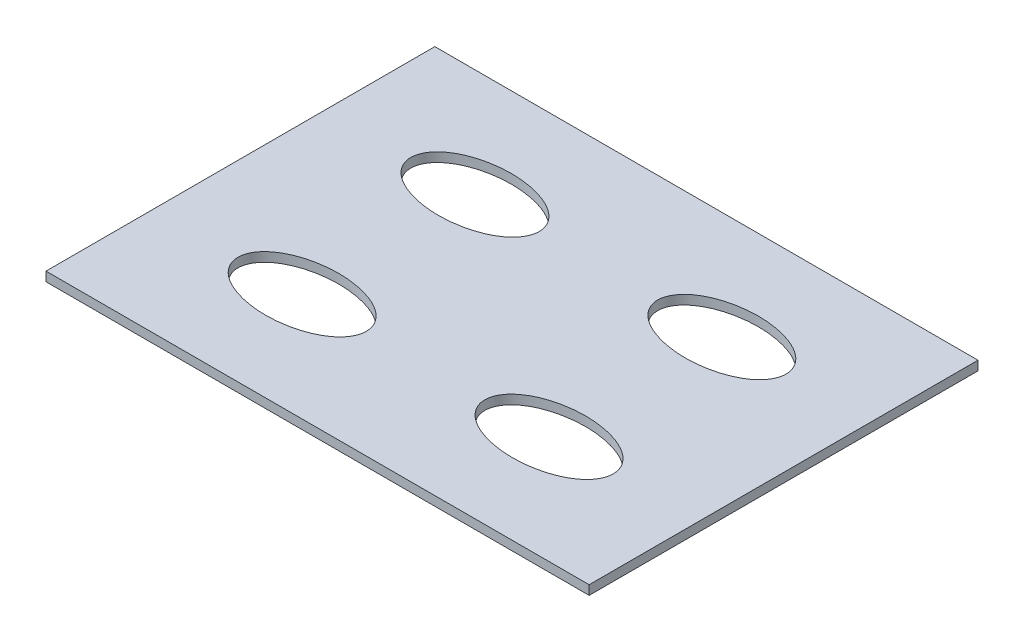
ISO-10303-21;
HEADER;
FILE_DESCRIPTION(('STEP AP214'),'2;1');
FILE_NAME('part.step','',(''),(''),'','','');
FILE_SCHEMA(('AUTOMOTIVE_DESIGN { 1 0 10303 214 1 1 1 1 }'));
ENDSEC;
DATA;
#1=APPLICATION_CONTEXT('core data for automotive mechanical design processes');
#2=APPLICATION_PROTOCOL_DEFINITION('international standard','automotive_design',2000,#1);
#3=PRODUCT_CONTEXT('',#1,'mechanical');
#4=PRODUCT('Part','Part','',(#3));
#5=PRODUCT_RELATED_PRODUCT_CATEGORY('part','',(#4));
#6=PRODUCT_DEFINITION_FORMATION('','',#4);
#7=PRODUCT_DEFINITION_CONTEXT('part definition',#1,'design');
#8=PRODUCT_DEFINITION('design','',#6,#7);
#9=PRODUCT_DEFINITION_SHAPE('','',#8);
#10=(LENGTH_UNIT() NAMED_UNIT(*) SI_UNIT(.MILLI.,.METRE.));
#11=(NAMED_UNIT(*) PLANE_ANGLE_UNIT() SI_UNIT($,.RADIAN.));
#12=(NAMED_UNIT(*) SI_UNIT($,.STERADIAN.) SOLID_ANGLE_UNIT());
#13=UNCERTAINTY_MEASURE_WITH_UNIT(LENGTH_MEASURE(1.E-05),#10,'distance_accuracy_value','');
#14=(GEOMETRIC_REPRESENTATION_CONTEXT(3) GLOBAL_UNCERTAINTY_ASSIGNED_CONTEXT((#13)) GLOBAL_UNIT_ASSIGNED_CONTEXT((#10,
#11,#12)) REPRESENTATION_CONTEXT('',''));
#15=CARTESIAN_POINT('',(0.,0.,0.));
#16=DIRECTION('',(0.,0.,1.));
#17=DIRECTION('',(1.,0.,0.));
#18=AXIS2_PLACEMENT_3D('',#15,#16,#17);
#19=CARTESIAN_POINT('',(0.,0.75,0.));
#20=DIRECTION('',(0.,1.,0.));
#21=DIRECTION('',(0.,0.,1.));
#22=AXIS2_PLACEMENT_3D('',#19,#20,#21);
#23=PLANE('',#22);
#24=CARTESIAN_POINT('',(4.8,0.75,-7.));
#25=CARTESIAN_POINT('',(4.8,0.75,-6.59500225181792));
#26=CARTESIAN_POINT('',(5.09948395130279,0.75,-5.78500675545376));
#27=CARTESIAN_POINT('',(6.66931282279761,0.75,-4.50337965273074));
#28=CARTESIAN_POINT('',(10.,0.75,-3.74774689817951));
#29=CARTESIAN_POINT('',(13.3306871772024,0.75,-4.50337965273074));
#30=CARTESIAN_POINT('',(14.9005160486972,0.75,-5.78500675545376));
#31=CARTESIAN_POINT('',(15.3497419756514,0.75,-7.));
#32=CARTESIAN_POINT('',(14.9005160486972,0.75,-8.21499324454625));
#33=CARTESIAN_POINT('',(13.3306871772024,0.75,-9.49662034726926));
#34=CARTESIAN_POINT('',(10.,0.75,-10.2522531018205));
#35=CARTESIAN_POINT('',(6.66931282279761,0.75,-9.49662034726926));
#36=CARTESIAN_POINT('',(5.09948395130279,0.75,-8.21499324454625));
#37=CARTESIAN_POINT('',(4.8,0.75,-7.40499774818209));
#38=CARTESIAN_POINT('',(4.8,0.75,-7.));
#39=B_SPLINE_CURVE_WITH_KNOTS('',3,(#24,#25,#26,#27,#28,#29,#30,#31,#32,#33,#34,#35,#36,#37,
#38),.UNSPECIFIED.,.T.,.F.,(4,1,1,1,1,1,1,1,1,1,1,1,4),(0.,0.392699081698724,0.785398163397448,
1.5707963267949,2.35619449019234,2.74889357189107,3.14159265358979,3.53429173528852,
3.92699081698724,4.71238898038469,5.49778714378214,5.89048622548086,6.28318530717959),.UNSPECIFIED.);
#40=CARTESIAN_POINT('',(4.8,0.75,-7.));
#41=VERTEX_POINT('',#40);
#42=EDGE_CURVE('E237',#41,#41,#39,.T.);
#43=ORIENTED_EDGE('',*,*,#42,.F.);
#44=EDGE_LOOP('',(#43));
#45=FACE_BOUND('',#44,.T.);
#46=CARTESIAN_POINT('',(-15.2,0.75,7.));
#47=CARTESIAN_POINT('',(-15.2,0.75,7.40499774818208));
#48=CARTESIAN_POINT('',(-14.9005160486972,0.75,8.21499324454624));
#49=CARTESIAN_POINT('',(-13.3306871772024,0.75,9.49662034726925));
#50=CARTESIAN_POINT('',(-10.,0.75,10.2522531018205));
#51=CARTESIAN_POINT('',(-6.66931282279761,0.75,9.49662034726926));
#52=CARTESIAN_POINT('',(-5.09948395130279,0.75,8.21499324454624));
#53=CARTESIAN_POINT('',(-4.6502580243486,0.75,7.));
#54=CARTESIAN_POINT('',(-5.09948395130279,0.75,5.78500675545376));
#55=CARTESIAN_POINT('',(-6.6693128227976,0.75,4.50337965273074));
#56=CARTESIAN_POINT('',(-10.,0.75,3.7477468981795));
#57=CARTESIAN_POINT('',(-13.3306871772024,0.75,4.50337965273073));
#58=CARTESIAN_POINT('',(-14.9005160486972,0.75,5.78500675545376));
#59=CARTESIAN_POINT('',(-15.2,0.75,6.59500225181792));
#60=CARTESIAN_POINT('',(-15.2,0.75,7.));
#61=B_SPLINE_CURVE_WITH_KNOTS('',3,(#46,#47,#48,#49,#50,#51,#52,#53,#54,#55,#56,#57,#58,#59,
#60),.UNSPECIFIED.,.T.,.F.,(4,1,1,1,1,1,1,1,1,1,1,1,4),(0.,0.392699081698724,0.785398163397448,
1.5707963267949,2.35619449019234,2.74889357189107,3.14159265358979,3.53429173528852,
3.92699081698724,4.71238898038469,5.49778714378214,5.89048622548086,6.28318530717959),.UNSPECIFIED.);
#62=CARTESIAN_POINT('',(-15.2,0.75,7.));
#63=VERTEX_POINT('',#62);
#64=EDGE_CURVE('E100',#63,#63,#61,.T.);
#65=ORIENTED_EDGE('',*,*,#64,.F.);
#66=EDGE_LOOP('',(#65));
#67=FACE_BOUND('',#66,.T.);
#68=DIRECTION('',(-1.,0.,0.));
#69=VECTOR('',#68,1.);
#70=CARTESIAN_POINT('',(22.,0.75,-15.75));
#71=LINE('',#70,#69);
#72=CARTESIAN_POINT('',(22.,0.75,-15.75));
#73=VERTEX_POINT('',#72);
#74=CARTESIAN_POINT('',(-22.,0.75,-15.75));
#75=VERTEX_POINT('',#74);
#76=EDGE_CURVE('E85',#73,#75,#71,.T.);
#77=ORIENTED_EDGE('',*,*,#76,.T.);
#78=DIRECTION('',(0.,0.,1.));
#79=VECTOR('',#78,1.);
#80=CARTESIAN_POINT('',(-22.,0.75,-15.75));
#81=LINE('',#80,#79);
#82=CARTESIAN_POINT('',(-22.,0.75,15.75));
#83=VERTEX_POINT('',#82);
#84=EDGE_CURVE('E80',#75,#83,#81,.T.);
#85=ORIENTED_EDGE('',*,*,#84,.T.);
#86=DIRECTION('',(1.,0.,0.));
#87=VECTOR('',#86,1.);
#88=CARTESIAN_POINT('',(-22.,0.75,15.75));
#89=LINE('',#88,#87);
#90=CARTESIAN_POINT('',(22.,0.75,15.75));
#91=VERTEX_POINT('',#90);
#92=EDGE_CURVE('E83',#83,#91,#89,.T.);
#93=ORIENTED_EDGE('',*,*,#92,.T.);
#94=DIRECTION('',(0.,0.,-1.));
#95=VECTOR('',#94,1.);
#96=CARTESIAN_POINT('',(22.,0.75,15.75));
#97=LINE('',#96,#95);
#98=EDGE_CURVE('E50',#91,#73,#97,.T.);
#99=ORIENTED_EDGE('',*,*,#98,.T.);
#100=EDGE_LOOP('',(#77,#85,#93,#99));
#101=FACE_BOUND('',#100,.T.);
#102=CARTESIAN_POINT('',(4.8,0.75,7.));
#103=CARTESIAN_POINT('',(4.8,0.75,7.40499774818208));
#104=CARTESIAN_POINT('',(5.09948395130279,0.75,8.21499324454624));
#105=CARTESIAN_POINT('',(6.66931282279761,0.75,9.49662034726925));
#106=CARTESIAN_POINT('',(10.,0.75,10.2522531018205));
#107=CARTESIAN_POINT('',(13.3306871772024,0.75,9.49662034726926));
#108=CARTESIAN_POINT('',(14.9005160486972,0.75,8.21499324454624));
#109=CARTESIAN_POINT('',(15.3497419756514,0.75,7.));
#110=CARTESIAN_POINT('',(14.9005160486972,0.75,5.78500675545376));
#111=CARTESIAN_POINT('',(13.3306871772024,0.75,4.50337965273074));
#112=CARTESIAN_POINT('',(10.,0.75,3.7477468981795));
#113=CARTESIAN_POINT('',(6.66931282279761,0.75,4.50337965273073));
#114=CARTESIAN_POINT('',(5.09948395130279,0.75,5.78500675545376));
#115=CARTESIAN_POINT('',(4.8,0.75,6.59500225181792));
#116=CARTESIAN_POINT('',(4.8,0.75,7.));
#117=B_SPLINE_CURVE_WITH_KNOTS('',3,(#102,#103,#104,#105,#106,#107,#108,#109,#110,#111,#112,
#113,#114,#115,#116),.UNSPECIFIED.,.T.,.F.,(4,1,1,1,1,1,1,1,1,1,1,1,4),(0.,0.392699081698724,
0.785398163397448,1.5707963267949,2.35619449019234,2.74889357189107,3.14159265358979,
3.53429173528852,3.92699081698724,4.71238898038469,5.49778714378214,5.89048622548086,
6.28318530717959),.UNSPECIFIED.);
#118=CARTESIAN_POINT('',(4.8,0.75,7.));
#119=VERTEX_POINT('',#118);
#120=EDGE_CURVE('E117',#119,#119,#117,.T.);
#121=ORIENTED_EDGE('',*,*,#120,.F.);
#122=EDGE_LOOP('',(#121));
#123=FACE_BOUND('',#122,.T.);
#124=CARTESIAN_POINT('',(-15.2,0.75,-7.));
#125=CARTESIAN_POINT('',(-15.2,0.75,-6.59500225181792));
#126=CARTESIAN_POINT('',(-14.9005160486972,0.75,-5.78500675545376));
#127=CARTESIAN_POINT('',(-13.3306871772024,0.75,-4.50337965273074));
#128=CARTESIAN_POINT('',(-10.,0.75,-3.74774689817951));
#129=CARTESIAN_POINT('',(-6.66931282279761,0.75,-4.50337965273074));
#130=CARTESIAN_POINT('',(-5.09948395130279,0.75,-5.78500675545376));
#131=CARTESIAN_POINT('',(-4.6502580243486,0.75,-7.));
#132=CARTESIAN_POINT('',(-5.09948395130279,0.75,-8.21499324454625));
#133=CARTESIAN_POINT('',(-6.6693128227976,0.75,-9.49662034726926));
#134=CARTESIAN_POINT('',(-10.,0.75,-10.2522531018205));
#135=CARTESIAN_POINT('',(-13.3306871772024,0.75,-9.49662034726926));
#136=CARTESIAN_POINT('',(-14.9005160486972,0.75,-8.21499324454625));
#137=CARTESIAN_POINT('',(-15.2,0.75,-7.40499774818209));
#138=CARTESIAN_POINT('',(-15.2,0.75,-7.));
#139=B_SPLINE_CURVE_WITH_KNOTS('',3,(#124,#125,#126,#127,#128,#129,#130,#131,#132,#133,#134,
#135,#136,#137,#138),.UNSPECIFIED.,.T.,.F.,(4,1,1,1,1,1,1,1,1,1,1,1,4),(0.,0.392699081698724,
0.785398163397448,1.5707963267949,2.35619449019234,2.74889357189107,3.14159265358979,
3.53429173528852,3.92699081698724,4.71238898038469,5.49778714378214,5.89048622548086,
6.28318530717959),.UNSPECIFIED.);
#140=CARTESIAN_POINT('',(-15.2,0.75,-7.));
#141=VERTEX_POINT('',#140);
#142=EDGE_CURVE('E224',#141,#141,#139,.T.);
#143=ORIENTED_EDGE('',*,*,#142,.F.);
#144=EDGE_LOOP('',(#143));
#145=FACE_BOUND('',#144,.T.);
#146=ADVANCED_FACE('F33',(#45,#67,#101,#123,#145),#23,.T.);
#147=CARTESIAN_POINT('',(0.,0.,0.));
#148=DIRECTION('',(0.,1.,0.));
#149=DIRECTION('',(0.,0.,1.));
#150=AXIS2_PLACEMENT_3D('',#147,#148,#149);
#151=PLANE('',#150);
#152=DIRECTION('',(-1.,0.,0.));
#153=VECTOR('',#152,1.);
#154=CARTESIAN_POINT('',(22.,0.,-15.75));
#155=LINE('',#154,#153);
#156=CARTESIAN_POINT('',(22.,0.,-15.75));
#157=VERTEX_POINT('',#156);
#158=CARTESIAN_POINT('',(-22.,0.,-15.75));
#159=VERTEX_POINT('',#158);
#160=EDGE_CURVE('E97',#157,#159,#155,.T.);
#161=ORIENTED_EDGE('',*,*,#160,.F.);
#162=DIRECTION('',(0.,0.,-1.));
#163=VECTOR('',#162,1.);
#164=CARTESIAN_POINT('',(22.,0.,15.75));
#165=LINE('',#164,#163);
#166=CARTESIAN_POINT('',(22.,0.,15.75));
#167=VERTEX_POINT('',#166);
#168=EDGE_CURVE('E73',#167,#157,#165,.T.);
#169=ORIENTED_EDGE('',*,*,#168,.F.);
#170=DIRECTION('',(1.,0.,0.));
#171=VECTOR('',#170,1.);
#172=CARTESIAN_POINT('',(-22.,0.,15.75));
#173=LINE('',#172,#171);
#174=CARTESIAN_POINT('',(-22.,0.,15.75));
#175=VERTEX_POINT('',#174);
#176=EDGE_CURVE('E67',#175,#167,#173,.T.);
#177=ORIENTED_EDGE('',*,*,#176,.F.);
#178=DIRECTION('',(0.,0.,1.));
#179=VECTOR('',#178,1.);
#180=CARTESIAN_POINT('',(-22.,0.,-15.75));
#181=LINE('',#180,#179);
#182=EDGE_CURVE('E89',#159,#175,#181,.T.);
#183=ORIENTED_EDGE('',*,*,#182,.F.);
#184=EDGE_LOOP('',(#161,#169,#177,#183));
#185=FACE_BOUND('',#184,.T.);
#186=CARTESIAN_POINT('',(-15.2,0.,7.));
#187=CARTESIAN_POINT('',(-15.2,0.,7.40499774818208));
#188=CARTESIAN_POINT('',(-14.9005160486972,0.,8.21499324454624));
#189=CARTESIAN_POINT('',(-13.3306871772024,0.,9.49662034726925));
#190=CARTESIAN_POINT('',(-10.,0.,10.2522531018205));
#191=CARTESIAN_POINT('',(-6.66931282279761,0.,9.49662034726926));
#192=CARTESIAN_POINT('',(-5.09948395130279,0.,8.21499324454624));
#193=CARTESIAN_POINT('',(-4.6502580243486,0.,7.));
#194=CARTESIAN_POINT('',(-5.09948395130279,0.,5.78500675545376));
#195=CARTESIAN_POINT('',(-6.6693128227976,0.,4.50337965273074));
#196=CARTESIAN_POINT('',(-10.,0.,3.7477468981795));
#197=CARTESIAN_POINT('',(-13.3306871772024,0.,4.50337965273073));
#198=CARTESIAN_POINT('',(-14.9005160486972,0.,5.78500675545376));
#199=CARTESIAN_POINT('',(-15.2,0.,6.59500225181792));
#200=CARTESIAN_POINT('',(-15.2,0.,7.));
#201=B_SPLINE_CURVE_WITH_KNOTS('',3,(#186,#187,#188,#189,#190,#191,#192,#193,#194,#195,#196,
#197,#198,#199,#200),.UNSPECIFIED.,.T.,.F.,(4,1,1,1,1,1,1,1,1,1,1,1,4),(0.,0.392699081698724,
0.785398163397448,1.5707963267949,2.35619449019234,2.74889357189107,3.14159265358979,
3.53429173528852,3.92699081698724,4.71238898038469,5.49778714378214,5.89048622548086,
6.28318530717959),.UNSPECIFIED.);
#202=CARTESIAN_POINT('',(-15.2,0.,7.));
#203=VERTEX_POINT('',#202);
#204=EDGE_CURVE('E112',#203,#203,#201,.T.);
#205=ORIENTED_EDGE('',*,*,#204,.T.);
#206=EDGE_LOOP('',(#205));
#207=FACE_BOUND('',#206,.T.);
#208=CARTESIAN_POINT('',(4.8,0.,7.));
#209=CARTESIAN_POINT('',(4.8,0.,7.40499774818208));
#210=CARTESIAN_POINT('',(5.09948395130279,0.,8.21499324454624));
#211=CARTESIAN_POINT('',(6.66931282279761,0.,9.49662034726925));
#212=CARTESIAN_POINT('',(10.,0.,10.2522531018205));
#213=CARTESIAN_POINT('',(13.3306871772024,0.,9.49662034726926));
#214=CARTESIAN_POINT('',(14.9005160486972,0.,8.21499324454624));
#215=CARTESIAN_POINT('',(15.3497419756514,0.,7.));
#216=CARTESIAN_POINT('',(14.9005160486972,0.,5.78500675545376));
#217=CARTESIAN_POINT('',(13.3306871772024,0.,4.50337965273074));
#218=CARTESIAN_POINT('',(10.,0.,3.7477468981795));
#219=CARTESIAN_POINT('',(6.66931282279761,0.,4.50337965273073));
#220=CARTESIAN_POINT('',(5.09948395130279,0.,5.78500675545376));
#221=CARTESIAN_POINT('',(4.8,0.,6.59500225181792));
#222=CARTESIAN_POINT('',(4.8,0.,7.));
#223=B_SPLINE_CURVE_WITH_KNOTS('',3,(#208,#209,#210,#211,#212,#213,#214,#215,#216,#217,#218,
#219,#220,#221,#222),.UNSPECIFIED.,.T.,.F.,(4,1,1,1,1,1,1,1,1,1,1,1,4),(0.,0.392699081698724,
0.785398163397448,1.5707963267949,2.35619449019234,2.74889357189107,3.14159265358979,
3.53429173528852,3.92699081698724,4.71238898038469,5.49778714378214,5.89048622548086,
6.28318530717959),.UNSPECIFIED.);
#224=CARTESIAN_POINT('',(4.8,0.,7.));
#225=VERTEX_POINT('',#224);
#226=EDGE_CURVE('E126',#225,#225,#223,.T.);
#227=ORIENTED_EDGE('',*,*,#226,.T.);
#228=EDGE_LOOP('',(#227));
#229=FACE_BOUND('',#228,.T.);
#230=CARTESIAN_POINT('',(4.8,0.,-7.));
#231=CARTESIAN_POINT('',(4.8,0.,-6.59500225181792));
#232=CARTESIAN_POINT('',(5.09948395130279,0.,-5.78500675545376));
#233=CARTESIAN_POINT('',(6.66931282279761,0.,-4.50337965273074));
#234=CARTESIAN_POINT('',(10.,0.,-3.74774689817951));
#235=CARTESIAN_POINT('',(13.3306871772024,0.,-4.50337965273074));
#236=CARTESIAN_POINT('',(14.9005160486972,0.,-5.78500675545376));
#237=CARTESIAN_POINT('',(15.3497419756514,0.,-7.));
#238=CARTESIAN_POINT('',(14.9005160486972,0.,-8.21499324454625));
#239=CARTESIAN_POINT('',(13.3306871772024,0.,-9.49662034726926));
#240=CARTESIAN_POINT('',(10.,0.,-10.2522531018205));
#241=CARTESIAN_POINT('',(6.66931282279761,0.,-9.49662034726926));
#242=CARTESIAN_POINT('',(5.09948395130279,0.,-8.21499324454625));
#243=CARTESIAN_POINT('',(4.8,0.,-7.40499774818209));
#244=CARTESIAN_POINT('',(4.8,0.,-7.));
#245=B_SPLINE_CURVE_WITH_KNOTS('',3,(#230,#231,#232,#233,#234,#235,#236,#237,#238,#239,#240,
#241,#242,#243,#244),.UNSPECIFIED.,.T.,.F.,(4,1,1,1,1,1,1,1,1,1,1,1,4),(0.,0.392699081698724,
0.785398163397448,1.5707963267949,2.35619449019234,2.74889357189107,3.14159265358979,
3.53429173528852,3.92699081698724,4.71238898038469,5.49778714378214,5.89048622548086,
6.28318530717959),.UNSPECIFIED.);
#246=CARTESIAN_POINT('',(4.8,0.,-7.));
#247=VERTEX_POINT('',#246);
#248=EDGE_CURVE('E229',#247,#247,#245,.T.);
#249=ORIENTED_EDGE('',*,*,#248,.T.);
#250=EDGE_LOOP('',(#249));
#251=FACE_BOUND('',#250,.T.);
#252=CARTESIAN_POINT('',(-15.2,0.,-7.));
#253=CARTESIAN_POINT('',(-15.2,0.,-6.59500225181792));
#254=CARTESIAN_POINT('',(-14.9005160486972,0.,-5.78500675545376));
#255=CARTESIAN_POINT('',(-13.3306871772024,0.,-4.50337965273074));
#256=CARTESIAN_POINT('',(-10.,0.,-3.74774689817951));
#257=CARTESIAN_POINT('',(-6.66931282279761,0.,-4.50337965273074));
#258=CARTESIAN_POINT('',(-5.09948395130279,0.,-5.78500675545376));
#259=CARTESIAN_POINT('',(-4.6502580243486,0.,-7.));
#260=CARTESIAN_POINT('',(-5.09948395130279,0.,-8.21499324454625));
#261=CARTESIAN_POINT('',(-6.6693128227976,0.,-9.49662034726926));
#262=CARTESIAN_POINT('',(-10.,0.,-10.2522531018205));
#263=CARTESIAN_POINT('',(-13.3306871772024,0.,-9.49662034726926));
#264=CARTESIAN_POINT('',(-14.9005160486972,0.,-8.21499324454625));
#265=CARTESIAN_POINT('',(-15.2,0.,-7.40499774818209));
#266=CARTESIAN_POINT('',(-15.2,0.,-7.));
#267=B_SPLINE_CURVE_WITH_KNOTS('',3,(#252,#253,#254,#255,#256,#257,#258,#259,#260,#261,#262,
#263,#264,#265,#266),.UNSPECIFIED.,.T.,.F.,(4,1,1,1,1,1,1,1,1,1,1,1,4),(0.,0.392699081698724,
0.785398163397448,1.5707963267949,2.35619449019234,2.74889357189107,3.14159265358979,
3.53429173528852,3.92699081698724,4.71238898038469,5.49778714378214,5.89048622548086,
6.28318530717959),.UNSPECIFIED.);
#268=CARTESIAN_POINT('',(-15.2,0.,-7.));
#269=VERTEX_POINT('',#268);
#270=EDGE_CURVE('E230',#269,#269,#267,.T.);
#271=ORIENTED_EDGE('',*,*,#270,.T.);
#272=EDGE_LOOP('',(#271));
#273=FACE_BOUND('',#272,.T.);
#274=ADVANCED_FACE('F108',(#185,#207,#229,#251,#273),#151,.F.);
#275=CARTESIAN_POINT('',(22.,0.75,-15.75));
#276=DIRECTION('',(0.,0.,1.));
#277=DIRECTION('',(1.,0.,0.));
#278=AXIS2_PLACEMENT_3D('',#275,#276,#277);
#279=PLANE('',#278);
#280=ORIENTED_EDGE('',*,*,#160,.T.);
#281=DIRECTION('',(0.,-1.,0.));
#282=VECTOR('',#281,1.);
#283=CARTESIAN_POINT('',(-22.,0.75,-15.75));
#284=LINE('',#283,#282);
#285=EDGE_CURVE('E11',#75,#159,#284,.T.);
#286=ORIENTED_EDGE('',*,*,#285,.F.);
#287=ORIENTED_EDGE('',*,*,#76,.F.);
#288=DIRECTION('',(0.,-1.,0.));
#289=VECTOR('',#288,1.);
#290=CARTESIAN_POINT('',(22.,0.75,-15.75));
#291=LINE('',#290,#289);
#292=EDGE_CURVE('E93',#73,#157,#291,.T.);
#293=ORIENTED_EDGE('',*,*,#292,.T.);
#294=EDGE_LOOP('',(#280,#286,#287,#293));
#295=FACE_BOUND('',#294,.T.);
#296=ADVANCED_FACE('F35',(#295),#279,.F.);
#297=CARTESIAN_POINT('',(-22.,0.75,-15.75));
#298=DIRECTION('',(1.,0.,0.));
#299=DIRECTION('',(0.,0.,-1.));
#300=AXIS2_PLACEMENT_3D('',#297,#298,#299);
#301=PLANE('',#300);
#302=ORIENTED_EDGE('',*,*,#182,.T.);
#303=DIRECTION('',(0.,-1.,0.));
#304=VECTOR('',#303,1.);
#305=CARTESIAN_POINT('',(-22.,0.75,15.75));
#306=LINE('',#305,#304);
#307=EDGE_CURVE('E42',#83,#175,#306,.T.);
#308=ORIENTED_EDGE('',*,*,#307,.F.);
#309=ORIENTED_EDGE('',*,*,#84,.F.);
#310=ORIENTED_EDGE('',*,*,#285,.T.);
#311=EDGE_LOOP('',(#302,#308,#309,#310));
#312=FACE_BOUND('',#311,.T.);
#313=ADVANCED_FACE('F88',(#312),#301,.F.);
#314=CARTESIAN_POINT('',(-22.,0.75,15.75));
#315=DIRECTION('',(0.,0.,-1.));
#316=DIRECTION('',(-1.,0.,0.));
#317=AXIS2_PLACEMENT_3D('',#314,#315,#316);
#318=PLANE('',#317);
#319=ORIENTED_EDGE('',*,*,#176,.T.);
#320=DIRECTION('',(0.,-1.,0.));
#321=VECTOR('',#320,1.);
#322=CARTESIAN_POINT('',(22.,0.75,15.75));
#323=LINE('',#322,#321);
#324=EDGE_CURVE('E90',#91,#167,#323,.T.);
#325=ORIENTED_EDGE('',*,*,#324,.F.);
#326=ORIENTED_EDGE('',*,*,#92,.F.);
#327=ORIENTED_EDGE('',*,*,#307,.T.);
#328=EDGE_LOOP('',(#319,#325,#326,#327));
#329=FACE_BOUND('',#328,.T.);
#330=ADVANCED_FACE('F91',(#329),#318,.F.);
#331=CARTESIAN_POINT('',(22.,0.75,15.75));
#332=DIRECTION('',(-1.,0.,0.));
#333=DIRECTION('',(0.,0.,1.));
#334=AXIS2_PLACEMENT_3D('',#331,#332,#333);
#335=PLANE('',#334);
#336=ORIENTED_EDGE('',*,*,#168,.T.);
#337=ORIENTED_EDGE('',*,*,#292,.F.);
#338=ORIENTED_EDGE('',*,*,#98,.F.);
#339=ORIENTED_EDGE('',*,*,#324,.T.);
#340=EDGE_LOOP('',(#336,#337,#338,#339));
#341=FACE_BOUND('',#340,.T.);
#342=ADVANCED_FACE('F105',(#341),#335,.F.);
#343=DIRECTION('',(0.,-1.,0.));
#344=VECTOR('',#343,1.);
#345=SURFACE_OF_LINEAR_EXTRUSION('',#61,#344);
#346=ORIENTED_EDGE('',*,*,#64,.T.);
#347=EDGE_LOOP('',(#346));
#348=FACE_BOUND('',#347,.T.);
#349=ORIENTED_EDGE('',*,*,#204,.F.);
#350=EDGE_LOOP('',(#349));
#351=FACE_BOUND('',#350,.T.);
#352=ADVANCED_FACE('F134',(#348,#351),#345,.T.);
#353=DIRECTION('',(0.,-1.,0.));
#354=VECTOR('',#353,1.);
#355=SURFACE_OF_LINEAR_EXTRUSION('',#117,#354);
#356=ORIENTED_EDGE('',*,*,#120,.T.);
#357=EDGE_LOOP('',(#356));
#358=FACE_BOUND('',#357,.T.);
#359=ORIENTED_EDGE('',*,*,#226,.F.);
#360=EDGE_LOOP('',(#359));
#361=FACE_BOUND('',#360,.T.);
#362=ADVANCED_FACE('F138',(#358,#361),#355,.T.);
#363=DIRECTION('',(0.,-1.,0.));
#364=VECTOR('',#363,1.);
#365=SURFACE_OF_LINEAR_EXTRUSION('',#39,#364);
#366=ORIENTED_EDGE('',*,*,#42,.T.);
#367=EDGE_LOOP('',(#366));
#368=FACE_BOUND('',#367,.T.);
#369=ORIENTED_EDGE('',*,*,#248,.F.);
#370=EDGE_LOOP('',(#369));
#371=FACE_BOUND('',#370,.T.);
#372=ADVANCED_FACE('F196',(#368,#371),#365,.T.);
#373=DIRECTION('',(0.,-1.,0.));
#374=VECTOR('',#373,1.);
#375=SURFACE_OF_LINEAR_EXTRUSION('',#139,#374);
#376=ORIENTED_EDGE('',*,*,#142,.T.);
#377=EDGE_LOOP('',(#376));
#378=FACE_BOUND('',#377,.T.);
#379=ORIENTED_EDGE('',*,*,#270,.F.);
#380=EDGE_LOOP('',(#379));
#381=FACE_BOUND('',#380,.T.);
#382=ADVANCED_FACE('F204',(#378,#381),#375,.T.);
#383=CLOSED_SHELL('',(#146,#274,#296,#313,#330,#342,#352,#362,#372,#382));
#384=MANIFOLD_SOLID_BREP('B2',#383);
#385=ADVANCED_BREP_SHAPE_REPRESENTATION('',(#18,#384),#14);
#386=SHAPE_DEFINITION_REPRESENTATION(#9,#385);
ENDSEC;
END-ISO-10303-21;
